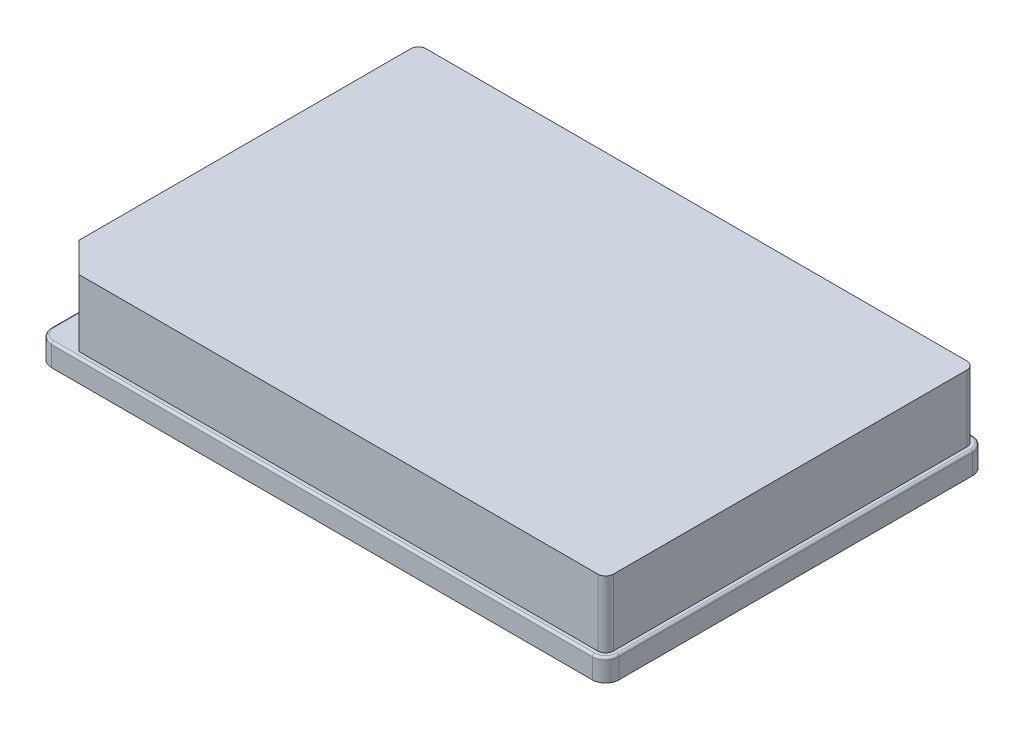
ISO-10303-21;
HEADER;
FILE_DESCRIPTION(('STEP AP214'),'2;1');
FILE_NAME('part.step','',(''),(''),'','','');
FILE_SCHEMA(('AUTOMOTIVE_DESIGN { 1 0 10303 214 1 1 1 1 }'));
ENDSEC;
DATA;
#1=APPLICATION_CONTEXT('core data for automotive mechanical design processes');
#2=APPLICATION_PROTOCOL_DEFINITION('international standard','automotive_design',2000,#1);
#3=PRODUCT_CONTEXT('',#1,'mechanical');
#4=PRODUCT('Part','Part','',(#3));
#5=PRODUCT_RELATED_PRODUCT_CATEGORY('part','',(#4));
#6=PRODUCT_DEFINITION_FORMATION('','',#4);
#7=PRODUCT_DEFINITION_CONTEXT('part definition',#1,'design');
#8=PRODUCT_DEFINITION('design','',#6,#7);
#9=PRODUCT_DEFINITION_SHAPE('','',#8);
#10=(LENGTH_UNIT() NAMED_UNIT(*) SI_UNIT(.MILLI.,.METRE.));
#11=(NAMED_UNIT(*) PLANE_ANGLE_UNIT() SI_UNIT($,.RADIAN.));
#12=(NAMED_UNIT(*) SI_UNIT($,.STERADIAN.) SOLID_ANGLE_UNIT());
#13=UNCERTAINTY_MEASURE_WITH_UNIT(LENGTH_MEASURE(1.E-05),#10,'distance_accuracy_value','');
#14=(GEOMETRIC_REPRESENTATION_CONTEXT(3) GLOBAL_UNCERTAINTY_ASSIGNED_CONTEXT((#13)) GLOBAL_UNIT_ASSIGNED_CONTEXT((#10,
#11,#12)) REPRESENTATION_CONTEXT('',''));
#15=CARTESIAN_POINT('',(0.,0.,0.));
#16=DIRECTION('',(0.,0.,1.));
#17=DIRECTION('',(1.,0.,0.));
#18=AXIS2_PLACEMENT_3D('',#15,#16,#17);
#19=CARTESIAN_POINT('',(-63.875,20.,42.8));
#20=DIRECTION('',(1.,0.,0.));
#21=DIRECTION('',(0.,0.,-1.));
#22=AXIS2_PLACEMENT_3D('',#19,#20,#21);
#23=PLANE('',#22);
#24=DIRECTION('',(0.,-1.,0.));
#25=VECTOR('',#24,1.);
#26=CARTESIAN_POINT('',(-63.875,20.,39.8));
#27=LINE('',#26,#25);
#28=CARTESIAN_POINT('',(-63.875,0.,39.8));
#29=VERTEX_POINT('',#28);
#30=CARTESIAN_POINT('',(-63.875,4.5,39.8));
#31=VERTEX_POINT('',#30);
#32=EDGE_CURVE('E250',#29,#31,#27,.F.);
#33=ORIENTED_EDGE('',*,*,#32,.T.);
#34=DIRECTION('',(0.,0.,1.));
#35=VECTOR('',#34,1.);
#36=CARTESIAN_POINT('',(-63.875,4.5,42.8));
#37=LINE('',#36,#35);
#38=CARTESIAN_POINT('',(-63.875,4.5,-39.8));
#39=VERTEX_POINT('',#38);
#40=EDGE_CURVE('E296',#31,#39,#37,.F.);
#41=ORIENTED_EDGE('',*,*,#40,.T.);
#42=DIRECTION('',(0.,-1.,0.));
#43=VECTOR('',#42,1.);
#44=CARTESIAN_POINT('',(-63.875,20.,-39.8));
#45=LINE('',#44,#43);
#46=CARTESIAN_POINT('',(-63.875,0.,-39.8));
#47=VERTEX_POINT('',#46);
#48=EDGE_CURVE('E253',#39,#47,#45,.T.);
#49=ORIENTED_EDGE('',*,*,#48,.T.);
#50=DIRECTION('',(0.,0.,1.));
#51=VECTOR('',#50,1.);
#52=CARTESIAN_POINT('',(-63.875,0.,42.8));
#53=LINE('',#52,#51);
#54=EDGE_CURVE('E210',#47,#29,#53,.T.);
#55=ORIENTED_EDGE('',*,*,#54,.T.);
#56=EDGE_LOOP('',(#33,#41,#49,#55));
#57=FACE_BOUND('',#56,.T.);
#58=ADVANCED_FACE('F37',(#57),#23,.F.);
#59=CARTESIAN_POINT('',(-63.875,20.,42.8));
#60=DIRECTION('',(0.,0.,-1.));
#61=DIRECTION('',(-1.,0.,0.));
#62=AXIS2_PLACEMENT_3D('',#59,#60,#61);
#63=PLANE('',#62);
#64=DIRECTION('',(0.,-1.,0.));
#65=VECTOR('',#64,1.);
#66=CARTESIAN_POINT('',(60.875,20.,42.8));
#67=LINE('',#66,#65);
#68=CARTESIAN_POINT('',(60.875,0.,42.8));
#69=VERTEX_POINT('',#68);
#70=CARTESIAN_POINT('',(60.875,4.5,42.8));
#71=VERTEX_POINT('',#70);
#72=EDGE_CURVE('E268',#69,#71,#67,.F.);
#73=ORIENTED_EDGE('',*,*,#72,.T.);
#74=DIRECTION('',(1.,0.,0.));
#75=VECTOR('',#74,1.);
#76=CARTESIAN_POINT('',(-63.875,4.5,42.8));
#77=LINE('',#76,#75);
#78=CARTESIAN_POINT('',(-60.875,4.5,42.8));
#79=VERTEX_POINT('',#78);
#80=EDGE_CURVE('E12',#71,#79,#77,.F.);
#81=ORIENTED_EDGE('',*,*,#80,.T.);
#82=DIRECTION('',(0.,-1.,0.));
#83=VECTOR('',#82,1.);
#84=CARTESIAN_POINT('',(-60.875,20.,42.8));
#85=LINE('',#84,#83);
#86=CARTESIAN_POINT('',(-60.875,0.,42.8));
#87=VERTEX_POINT('',#86);
#88=EDGE_CURVE('E270',#79,#87,#85,.T.);
#89=ORIENTED_EDGE('',*,*,#88,.T.);
#90=DIRECTION('',(1.,0.,0.));
#91=VECTOR('',#90,1.);
#92=CARTESIAN_POINT('',(-63.875,0.,42.8));
#93=LINE('',#92,#91);
#94=EDGE_CURVE('E241',#87,#69,#93,.T.);
#95=ORIENTED_EDGE('',*,*,#94,.T.);
#96=EDGE_LOOP('',(#73,#81,#89,#95));
#97=FACE_BOUND('',#96,.T.);
#98=ADVANCED_FACE('F381',(#97),#63,.F.);
#99=CARTESIAN_POINT('',(63.875,20.,42.8));
#100=DIRECTION('',(-1.,0.,0.));
#101=DIRECTION('',(0.,0.,1.));
#102=AXIS2_PLACEMENT_3D('',#99,#100,#101);
#103=PLANE('',#102);
#104=DIRECTION('',(0.,-1.,0.));
#105=VECTOR('',#104,1.);
#106=CARTESIAN_POINT('',(63.875,20.,-39.8));
#107=LINE('',#106,#105);
#108=CARTESIAN_POINT('',(63.875,0.,-39.8));
#109=VERTEX_POINT('',#108);
#110=CARTESIAN_POINT('',(63.875,4.5,-39.8));
#111=VERTEX_POINT('',#110);
#112=EDGE_CURVE('E272',#109,#111,#107,.F.);
#113=ORIENTED_EDGE('',*,*,#112,.T.);
#114=DIRECTION('',(0.,0.,-1.));
#115=VECTOR('',#114,1.);
#116=CARTESIAN_POINT('',(63.875,4.5,42.8));
#117=LINE('',#116,#115);
#118=CARTESIAN_POINT('',(63.875,4.5,39.8));
#119=VERTEX_POINT('',#118);
#120=EDGE_CURVE('E61',#111,#119,#117,.F.);
#121=ORIENTED_EDGE('',*,*,#120,.T.);
#122=DIRECTION('',(0.,-1.,0.));
#123=VECTOR('',#122,1.);
#124=CARTESIAN_POINT('',(63.875,20.,39.8));
#125=LINE('',#124,#123);
#126=CARTESIAN_POINT('',(63.875,0.,39.8));
#127=VERTEX_POINT('',#126);
#128=EDGE_CURVE('E274',#119,#127,#125,.T.);
#129=ORIENTED_EDGE('',*,*,#128,.T.);
#130=DIRECTION('',(0.,0.,-1.));
#131=VECTOR('',#130,1.);
#132=CARTESIAN_POINT('',(63.875,0.,42.8));
#133=LINE('',#132,#131);
#134=EDGE_CURVE('E244',#127,#109,#133,.T.);
#135=ORIENTED_EDGE('',*,*,#134,.T.);
#136=EDGE_LOOP('',(#113,#121,#129,#135));
#137=FACE_BOUND('',#136,.T.);
#138=ADVANCED_FACE('F341',(#137),#103,.F.);
#139=CARTESIAN_POINT('',(-63.875,20.,-42.8));
#140=DIRECTION('',(0.,0.,1.));
#141=DIRECTION('',(1.,0.,0.));
#142=AXIS2_PLACEMENT_3D('',#139,#140,#141);
#143=PLANE('',#142);
#144=DIRECTION('',(0.,-1.,0.));
#145=VECTOR('',#144,1.);
#146=CARTESIAN_POINT('',(-60.875,20.,-42.8));
#147=LINE('',#146,#145);
#148=CARTESIAN_POINT('',(-60.875,0.,-42.8));
#149=VERTEX_POINT('',#148);
#150=CARTESIAN_POINT('',(-60.875,4.5,-42.8));
#151=VERTEX_POINT('',#150);
#152=EDGE_CURVE('E265',#149,#151,#147,.F.);
#153=ORIENTED_EDGE('',*,*,#152,.T.);
#154=DIRECTION('',(-1.,0.,0.));
#155=VECTOR('',#154,1.);
#156=CARTESIAN_POINT('',(-63.875,4.5,-42.8));
#157=LINE('',#156,#155);
#158=CARTESIAN_POINT('',(60.875,4.5,-42.8));
#159=VERTEX_POINT('',#158);
#160=EDGE_CURVE('E300',#151,#159,#157,.F.);
#161=ORIENTED_EDGE('',*,*,#160,.T.);
#162=DIRECTION('',(0.,-1.,0.));
#163=VECTOR('',#162,1.);
#164=CARTESIAN_POINT('',(60.875,20.,-42.8));
#165=LINE('',#164,#163);
#166=CARTESIAN_POINT('',(60.875,0.,-42.8));
#167=VERTEX_POINT('',#166);
#168=EDGE_CURVE('E263',#159,#167,#165,.T.);
#169=ORIENTED_EDGE('',*,*,#168,.T.);
#170=DIRECTION('',(-1.,0.,0.));
#171=VECTOR('',#170,1.);
#172=CARTESIAN_POINT('',(-63.875,0.,-42.8));
#173=LINE('',#172,#171);
#174=EDGE_CURVE('E247',#167,#149,#173,.T.);
#175=ORIENTED_EDGE('',*,*,#174,.T.);
#176=EDGE_LOOP('',(#153,#161,#169,#175));
#177=FACE_BOUND('',#176,.T.);
#178=ADVANCED_FACE('F352',(#177),#143,.F.);
#179=CARTESIAN_POINT('',(0.,0.,0.));
#180=DIRECTION('',(0.,-1.,0.));
#181=DIRECTION('',(0.,0.,-1.));
#182=AXIS2_PLACEMENT_3D('',#179,#180,#181);
#183=PLANE('',#182);
#184=ORIENTED_EDGE('',*,*,#54,.F.);
#185=CARTESIAN_POINT('',(-60.875,0.,-39.8));
#186=DIRECTION('',(0.,-1.,0.));
#187=DIRECTION('',(0.,0.,-1.));
#188=AXIS2_PLACEMENT_3D('',#185,#186,#187);
#189=CIRCLE('',#188,3.);
#190=EDGE_CURVE('E261',#47,#149,#189,.T.);
#191=ORIENTED_EDGE('',*,*,#190,.T.);
#192=ORIENTED_EDGE('',*,*,#174,.F.);
#193=CARTESIAN_POINT('',(60.875,0.,-39.8));
#194=DIRECTION('',(0.,-1.,0.));
#195=DIRECTION('',(0.,0.,-1.));
#196=AXIS2_PLACEMENT_3D('',#193,#194,#195);
#197=CIRCLE('',#196,3.);
#198=EDGE_CURVE('E255',#167,#109,#197,.T.);
#199=ORIENTED_EDGE('',*,*,#198,.T.);
#200=ORIENTED_EDGE('',*,*,#134,.F.);
#201=CARTESIAN_POINT('',(60.875,0.,39.8));
#202=DIRECTION('',(0.,-1.,0.));
#203=DIRECTION('',(0.,0.,-1.));
#204=AXIS2_PLACEMENT_3D('',#201,#202,#203);
#205=CIRCLE('',#204,3.);
#206=EDGE_CURVE('E257',#127,#69,#205,.T.);
#207=ORIENTED_EDGE('',*,*,#206,.T.);
#208=ORIENTED_EDGE('',*,*,#94,.F.);
#209=CARTESIAN_POINT('',(-60.875,0.,39.8));
#210=DIRECTION('',(0.,-1.,0.));
#211=DIRECTION('',(0.,0.,-1.));
#212=AXIS2_PLACEMENT_3D('',#209,#210,#211);
#213=CIRCLE('',#212,3.);
#214=EDGE_CURVE('E259',#87,#29,#213,.T.);
#215=ORIENTED_EDGE('',*,*,#214,.T.);
#216=EDGE_LOOP('',(#184,#191,#192,#199,#200,#207,#208,#215));
#217=FACE_BOUND('',#216,.T.);
#218=ADVANCED_FACE('F346',(#217),#183,.T.);
#219=CARTESIAN_POINT('',(-60.875,20.,-39.8));
#220=DIRECTION('',(0.,-1.,0.));
#221=DIRECTION('',(0.,0.,-1.));
#222=AXIS2_PLACEMENT_3D('',#219,#220,#221);
#223=CYLINDRICAL_SURFACE('',#222,3.);
#224=ORIENTED_EDGE('',*,*,#48,.F.);
#225=CARTESIAN_POINT('',(-60.875,4.5,-39.8));
#226=DIRECTION('',(0.,-1.,0.));
#227=DIRECTION('',(0.,0.,-1.));
#228=AXIS2_PLACEMENT_3D('',#225,#226,#227);
#229=CIRCLE('',#228,3.);
#230=EDGE_CURVE('E298',#39,#151,#229,.T.);
#231=ORIENTED_EDGE('',*,*,#230,.T.);
#232=ORIENTED_EDGE('',*,*,#152,.F.);
#233=ORIENTED_EDGE('',*,*,#190,.F.);
#234=EDGE_LOOP('',(#224,#231,#232,#233));
#235=FACE_BOUND('',#234,.T.);
#236=ADVANCED_FACE('F355',(#235),#223,.T.);
#237=CARTESIAN_POINT('',(-60.875,20.,39.8));
#238=DIRECTION('',(0.,-1.,0.));
#239=DIRECTION('',(0.,0.,-1.));
#240=AXIS2_PLACEMENT_3D('',#237,#238,#239);
#241=CYLINDRICAL_SURFACE('',#240,3.);
#242=ORIENTED_EDGE('',*,*,#88,.F.);
#243=CARTESIAN_POINT('',(-60.875,4.5,39.8));
#244=DIRECTION('',(0.,-1.,0.));
#245=DIRECTION('',(0.,0.,-1.));
#246=AXIS2_PLACEMENT_3D('',#243,#244,#245);
#247=CIRCLE('',#246,3.);
#248=EDGE_CURVE('E293',#79,#31,#247,.T.);
#249=ORIENTED_EDGE('',*,*,#248,.T.);
#250=ORIENTED_EDGE('',*,*,#32,.F.);
#251=ORIENTED_EDGE('',*,*,#214,.F.);
#252=EDGE_LOOP('',(#242,#249,#250,#251));
#253=FACE_BOUND('',#252,.T.);
#254=ADVANCED_FACE('F385',(#253),#241,.T.);
#255=CARTESIAN_POINT('',(60.875,20.,39.8));
#256=DIRECTION('',(0.,-1.,0.));
#257=DIRECTION('',(0.,0.,-1.));
#258=AXIS2_PLACEMENT_3D('',#255,#256,#257);
#259=CYLINDRICAL_SURFACE('',#258,3.);
#260=ORIENTED_EDGE('',*,*,#128,.F.);
#261=CARTESIAN_POINT('',(60.875,4.5,39.8));
#262=DIRECTION('',(0.,-1.,0.));
#263=DIRECTION('',(0.,0.,-1.));
#264=AXIS2_PLACEMENT_3D('',#261,#262,#263);
#265=CIRCLE('',#264,3.);
#266=EDGE_CURVE('E46',#119,#71,#265,.T.);
#267=ORIENTED_EDGE('',*,*,#266,.T.);
#268=ORIENTED_EDGE('',*,*,#72,.F.);
#269=ORIENTED_EDGE('',*,*,#206,.F.);
#270=EDGE_LOOP('',(#260,#267,#268,#269));
#271=FACE_BOUND('',#270,.T.);
#272=ADVANCED_FACE('F409',(#271),#259,.T.);
#273=CARTESIAN_POINT('',(60.875,20.,-39.8));
#274=DIRECTION('',(0.,-1.,0.));
#275=DIRECTION('',(0.,0.,-1.));
#276=AXIS2_PLACEMENT_3D('',#273,#274,#275);
#277=CYLINDRICAL_SURFACE('',#276,3.);
#278=ORIENTED_EDGE('',*,*,#168,.F.);
#279=CARTESIAN_POINT('',(60.875,4.5,-39.8));
#280=DIRECTION('',(0.,-1.,0.));
#281=DIRECTION('',(0.,0.,-1.));
#282=AXIS2_PLACEMENT_3D('',#279,#280,#281);
#283=CIRCLE('',#282,3.);
#284=EDGE_CURVE('E302',#159,#111,#283,.T.);
#285=ORIENTED_EDGE('',*,*,#284,.T.);
#286=ORIENTED_EDGE('',*,*,#112,.F.);
#287=ORIENTED_EDGE('',*,*,#198,.F.);
#288=EDGE_LOOP('',(#278,#285,#286,#287));
#289=FACE_BOUND('',#288,.T.);
#290=ADVANCED_FACE('F339',(#289),#277,.T.);
#291=CARTESIAN_POINT('',(-60.875,-153.777184588612,-39.8));
#292=DIRECTION('',(0.,1.,0.));
#293=DIRECTION('',(0.,0.,1.));
#294=AXIS2_PLACEMENT_3D('',#291,#292,#293);
#295=CYLINDRICAL_SURFACE('',#294,1.75000000000002);
#296=CARTESIAN_POINT('',(-60.875,5.,-39.8));
#297=DIRECTION('',(0.,-1.,0.));
#298=DIRECTION('',(0.,0.,-1.));
#299=AXIS2_PLACEMENT_3D('',#296,#297,#298);
#300=CIRCLE('',#299,1.75000000000002);
#301=CARTESIAN_POINT('',(-60.875,5.,-41.55));
#302=VERTEX_POINT('',#301);
#303=CARTESIAN_POINT('',(-62.625,5.,-39.8));
#304=VERTEX_POINT('',#303);
#305=EDGE_CURVE('E192',#302,#304,#300,.F.);
#306=ORIENTED_EDGE('',*,*,#305,.T.);
#307=DIRECTION('',(0.,1.,0.));
#308=VECTOR('',#307,1.);
#309=CARTESIAN_POINT('',(-62.625,-153.777184588612,-39.8));
#310=LINE('',#309,#308);
#311=CARTESIAN_POINT('',(-62.625,20.,-39.8));
#312=VERTEX_POINT('',#311);
#313=EDGE_CURVE('E176',#304,#312,#310,.T.);
#314=ORIENTED_EDGE('',*,*,#313,.T.);
#315=CARTESIAN_POINT('',(-60.875,20.,-39.8));
#316=DIRECTION('',(0.,1.,0.));
#317=DIRECTION('',(0.,0.,1.));
#318=AXIS2_PLACEMENT_3D('',#315,#316,#317);
#319=CIRCLE('',#318,1.75000000000002);
#320=CARTESIAN_POINT('',(-60.875,20.,-41.55));
#321=VERTEX_POINT('',#320);
#322=EDGE_CURVE('E204',#321,#312,#319,.T.);
#323=ORIENTED_EDGE('',*,*,#322,.F.);
#324=DIRECTION('',(0.,1.,0.));
#325=VECTOR('',#324,1.);
#326=CARTESIAN_POINT('',(-60.875,-153.777184588612,-41.55));
#327=LINE('',#326,#325);
#328=EDGE_CURVE('E198',#302,#321,#327,.T.);
#329=ORIENTED_EDGE('',*,*,#328,.F.);
#330=EDGE_LOOP('',(#306,#314,#323,#329));
#331=FACE_BOUND('',#330,.T.);
#332=ADVANCED_FACE('F197',(#331),#295,.T.);
#333=CARTESIAN_POINT('',(60.875,-153.777184588612,-41.55));
#334=DIRECTION('',(0.,0.,-1.));
#335=DIRECTION('',(-1.,0.,0.));
#336=AXIS2_PLACEMENT_3D('',#333,#334,#335);
#337=PLANE('',#336);
#338=DIRECTION('',(-1.,0.,0.));
#339=VECTOR('',#338,1.);
#340=CARTESIAN_POINT('',(60.875,5.,-41.55));
#341=LINE('',#340,#339);
#342=CARTESIAN_POINT('',(60.875,5.,-41.55));
#343=VERTEX_POINT('',#342);
#344=EDGE_CURVE('E200',#343,#302,#341,.T.);
#345=ORIENTED_EDGE('',*,*,#344,.T.);
#346=ORIENTED_EDGE('',*,*,#328,.T.);
#347=DIRECTION('',(-1.,0.,0.));
#348=VECTOR('',#347,1.);
#349=CARTESIAN_POINT('',(60.875,20.,-41.55));
#350=LINE('',#349,#348);
#351=CARTESIAN_POINT('',(60.875,20.,-41.55));
#352=VERTEX_POINT('',#351);
#353=EDGE_CURVE('E224',#352,#321,#350,.T.);
#354=ORIENTED_EDGE('',*,*,#353,.F.);
#355=DIRECTION('',(0.,1.,0.));
#356=VECTOR('',#355,1.);
#357=CARTESIAN_POINT('',(60.875,-153.777184588612,-41.55));
#358=LINE('',#357,#356);
#359=EDGE_CURVE('E222',#343,#352,#358,.T.);
#360=ORIENTED_EDGE('',*,*,#359,.F.);
#361=EDGE_LOOP('',(#345,#346,#354,#360));
#362=FACE_BOUND('',#361,.T.);
#363=ADVANCED_FACE('F415',(#362),#337,.T.);
#364=CARTESIAN_POINT('',(60.875,-153.777184588612,-39.8));
#365=DIRECTION('',(0.,1.,0.));
#366=DIRECTION('',(0.,0.,1.));
#367=AXIS2_PLACEMENT_3D('',#364,#365,#366);
#368=CYLINDRICAL_SURFACE('',#367,1.75);
#369=CARTESIAN_POINT('',(60.875,5.,-39.8));
#370=DIRECTION('',(0.,-1.,0.));
#371=DIRECTION('',(0.,0.,-1.));
#372=AXIS2_PLACEMENT_3D('',#369,#370,#371);
#373=CIRCLE('',#372,1.75);
#374=CARTESIAN_POINT('',(62.625,5.,-39.8));
#375=VERTEX_POINT('',#374);
#376=EDGE_CURVE('E207',#375,#343,#373,.F.);
#377=ORIENTED_EDGE('',*,*,#376,.T.);
#378=ORIENTED_EDGE('',*,*,#359,.T.);
#379=CARTESIAN_POINT('',(60.875,20.,-39.8));
#380=DIRECTION('',(0.,1.,0.));
#381=DIRECTION('',(0.,0.,1.));
#382=AXIS2_PLACEMENT_3D('',#379,#380,#381);
#383=CIRCLE('',#382,1.75);
#384=CARTESIAN_POINT('',(62.625,20.,-39.8));
#385=VERTEX_POINT('',#384);
#386=EDGE_CURVE('E227',#385,#352,#383,.T.);
#387=ORIENTED_EDGE('',*,*,#386,.F.);
#388=DIRECTION('',(0.,1.,0.));
#389=VECTOR('',#388,1.);
#390=CARTESIAN_POINT('',(62.625,-153.777184588612,-39.8));
#391=LINE('',#390,#389);
#392=EDGE_CURVE('E225',#375,#385,#391,.T.);
#393=ORIENTED_EDGE('',*,*,#392,.F.);
#394=EDGE_LOOP('',(#377,#378,#387,#393));
#395=FACE_BOUND('',#394,.T.);
#396=ADVANCED_FACE('F420',(#395),#368,.T.);
#397=CARTESIAN_POINT('',(62.625,-153.777184588612,39.8));
#398=DIRECTION('',(1.,0.,0.));
#399=DIRECTION('',(0.,0.,-1.));
#400=AXIS2_PLACEMENT_3D('',#397,#398,#399);
#401=PLANE('',#400);
#402=DIRECTION('',(0.,0.,-1.));
#403=VECTOR('',#402,1.);
#404=CARTESIAN_POINT('',(62.625,5.,39.8));
#405=LINE('',#404,#403);
#406=CARTESIAN_POINT('',(62.625,5.,39.8));
#407=VERTEX_POINT('',#406);
#408=EDGE_CURVE('E211',#407,#375,#405,.T.);
#409=ORIENTED_EDGE('',*,*,#408,.T.);
#410=ORIENTED_EDGE('',*,*,#392,.T.);
#411=DIRECTION('',(0.,0.,-1.));
#412=VECTOR('',#411,1.);
#413=CARTESIAN_POINT('',(62.625,20.,39.8));
#414=LINE('',#413,#412);
#415=CARTESIAN_POINT('',(62.625,20.,39.8));
#416=VERTEX_POINT('',#415);
#417=EDGE_CURVE('E230',#416,#385,#414,.T.);
#418=ORIENTED_EDGE('',*,*,#417,.F.);
#419=DIRECTION('',(0.,1.,0.));
#420=VECTOR('',#419,1.);
#421=CARTESIAN_POINT('',(62.625,-153.777184588612,39.8));
#422=LINE('',#421,#420);
#423=EDGE_CURVE('E228',#407,#416,#422,.T.);
#424=ORIENTED_EDGE('',*,*,#423,.F.);
#425=EDGE_LOOP('',(#409,#410,#418,#424));
#426=FACE_BOUND('',#425,.T.);
#427=ADVANCED_FACE('F600',(#426),#401,.T.);
#428=CARTESIAN_POINT('',(60.875,-153.777184588612,39.8));
#429=DIRECTION('',(0.,1.,0.));
#430=DIRECTION('',(0.,0.,1.));
#431=AXIS2_PLACEMENT_3D('',#428,#429,#430);
#432=CYLINDRICAL_SURFACE('',#431,1.75);
#433=CARTESIAN_POINT('',(60.875,5.,39.8));
#434=DIRECTION('',(0.,-1.,0.));
#435=DIRECTION('',(0.,0.,-1.));
#436=AXIS2_PLACEMENT_3D('',#433,#434,#435);
#437=CIRCLE('',#436,1.75);
#438=CARTESIAN_POINT('',(60.875,5.,41.55));
#439=VERTEX_POINT('',#438);
#440=EDGE_CURVE('E214',#439,#407,#437,.F.);
#441=ORIENTED_EDGE('',*,*,#440,.T.);
#442=ORIENTED_EDGE('',*,*,#423,.T.);
#443=CARTESIAN_POINT('',(60.875,20.,39.8));
#444=DIRECTION('',(0.,1.,0.));
#445=DIRECTION('',(0.,0.,1.));
#446=AXIS2_PLACEMENT_3D('',#443,#444,#445);
#447=CIRCLE('',#446,1.75);
#448=CARTESIAN_POINT('',(60.875,20.,41.55));
#449=VERTEX_POINT('',#448);
#450=EDGE_CURVE('E233',#449,#416,#447,.T.);
#451=ORIENTED_EDGE('',*,*,#450,.F.);
#452=DIRECTION('',(0.,1.,0.));
#453=VECTOR('',#452,1.);
#454=CARTESIAN_POINT('',(60.875,-153.777184588612,41.55));
#455=LINE('',#454,#453);
#456=EDGE_CURVE('E231',#439,#449,#455,.T.);
#457=ORIENTED_EDGE('',*,*,#456,.F.);
#458=EDGE_LOOP('',(#441,#442,#451,#457));
#459=FACE_BOUND('',#458,.T.);
#460=ADVANCED_FACE('F590',(#459),#432,.T.);
#461=CARTESIAN_POINT('',(-55.8750000000001,-153.777184588612,41.55));
#462=DIRECTION('',(0.,0.,1.));
#463=DIRECTION('',(1.,0.,0.));
#464=AXIS2_PLACEMENT_3D('',#461,#462,#463);
#465=PLANE('',#464);
#466=DIRECTION('',(1.,0.,0.));
#467=VECTOR('',#466,1.);
#468=CARTESIAN_POINT('',(-55.8750000000001,5.,41.55));
#469=LINE('',#468,#467);
#470=CARTESIAN_POINT('',(-55.8750000000001,5.,41.55));
#471=VERTEX_POINT('',#470);
#472=EDGE_CURVE('E217',#471,#439,#469,.T.);
#473=ORIENTED_EDGE('',*,*,#472,.T.);
#474=ORIENTED_EDGE('',*,*,#456,.T.);
#475=DIRECTION('',(1.,0.,0.));
#476=VECTOR('',#475,1.);
#477=CARTESIAN_POINT('',(-55.8750000000001,20.,41.55));
#478=LINE('',#477,#476);
#479=CARTESIAN_POINT('',(-55.8750000000001,20.,41.55));
#480=VERTEX_POINT('',#479);
#481=EDGE_CURVE('E236',#480,#449,#478,.T.);
#482=ORIENTED_EDGE('',*,*,#481,.F.);
#483=DIRECTION('',(0.,1.,0.));
#484=VECTOR('',#483,1.);
#485=CARTESIAN_POINT('',(-55.8750000000001,-153.777184588612,41.55));
#486=LINE('',#485,#484);
#487=EDGE_CURVE('E234',#471,#480,#486,.T.);
#488=ORIENTED_EDGE('',*,*,#487,.F.);
#489=EDGE_LOOP('',(#473,#474,#482,#488));
#490=FACE_BOUND('',#489,.T.);
#491=ADVANCED_FACE('F580',(#490),#465,.T.);
#492=CARTESIAN_POINT('',(-62.625,-153.777184588612,34.8));
#493=DIRECTION('',(-0.707106781186554,0.,0.707106781186541));
#494=DIRECTION('',(0.707106781186541,0.,0.707106781186554));
#495=AXIS2_PLACEMENT_3D('',#492,#493,#494);
#496=PLANE('',#495);
#497=DIRECTION('',(0.707106781186541,0.,0.707106781186554));
#498=VECTOR('',#497,1.);
#499=CARTESIAN_POINT('',(-62.625,5.,34.8));
#500=LINE('',#499,#498);
#501=CARTESIAN_POINT('',(-62.625,5.,34.8));
#502=VERTEX_POINT('',#501);
#503=EDGE_CURVE('E195',#502,#471,#500,.T.);
#504=ORIENTED_EDGE('',*,*,#503,.T.);
#505=ORIENTED_EDGE('',*,*,#487,.T.);
#506=DIRECTION('',(0.707106781186541,0.,0.707106781186554));
#507=VECTOR('',#506,1.);
#508=CARTESIAN_POINT('',(-62.625,20.,34.8));
#509=LINE('',#508,#507);
#510=CARTESIAN_POINT('',(-62.625,20.,34.8));
#511=VERTEX_POINT('',#510);
#512=EDGE_CURVE('E187',#511,#480,#509,.T.);
#513=ORIENTED_EDGE('',*,*,#512,.F.);
#514=DIRECTION('',(0.,1.,0.));
#515=VECTOR('',#514,1.);
#516=CARTESIAN_POINT('',(-62.625,-153.777184588612,34.8));
#517=LINE('',#516,#515);
#518=EDGE_CURVE('E237',#502,#511,#517,.T.);
#519=ORIENTED_EDGE('',*,*,#518,.F.);
#520=EDGE_LOOP('',(#504,#505,#513,#519));
#521=FACE_BOUND('',#520,.T.);
#522=ADVANCED_FACE('F571',(#521),#496,.T.);
#523=CARTESIAN_POINT('',(-62.625,-153.777184588612,-39.8));
#524=DIRECTION('',(-1.,0.,0.));
#525=DIRECTION('',(0.,0.,1.));
#526=AXIS2_PLACEMENT_3D('',#523,#524,#525);
#527=PLANE('',#526);
#528=DIRECTION('',(0.,0.,1.));
#529=VECTOR('',#528,1.);
#530=CARTESIAN_POINT('',(-62.625,5.,-39.8));
#531=LINE('',#530,#529);
#532=EDGE_CURVE('E180',#304,#502,#531,.T.);
#533=ORIENTED_EDGE('',*,*,#532,.T.);
#534=ORIENTED_EDGE('',*,*,#518,.T.);
#535=DIRECTION('',(0.,0.,1.));
#536=VECTOR('',#535,1.);
#537=CARTESIAN_POINT('',(-62.625,20.,-39.8));
#538=LINE('',#537,#536);
#539=EDGE_CURVE('E182',#312,#511,#538,.T.);
#540=ORIENTED_EDGE('',*,*,#539,.F.);
#541=ORIENTED_EDGE('',*,*,#313,.F.);
#542=EDGE_LOOP('',(#533,#534,#540,#541));
#543=FACE_BOUND('',#542,.T.);
#544=ADVANCED_FACE('F178',(#543),#527,.T.);
#545=CARTESIAN_POINT('',(0.,5.,0.));
#546=DIRECTION('',(0.,-1.,0.));
#547=DIRECTION('',(0.,0.,-1.));
#548=AXIS2_PLACEMENT_3D('',#545,#546,#547);
#549=PLANE('',#548);
#550=DIRECTION('',(0.,0.,1.));
#551=VECTOR('',#550,1.);
#552=CARTESIAN_POINT('',(-63.375,5.,0.));
#553=LINE('',#552,#551);
#554=CARTESIAN_POINT('',(-63.375,5.,-39.8));
#555=VERTEX_POINT('',#554);
#556=CARTESIAN_POINT('',(-63.375,5.,39.8));
#557=VERTEX_POINT('',#556);
#558=EDGE_CURVE('E288',#555,#557,#553,.T.);
#559=ORIENTED_EDGE('',*,*,#558,.T.);
#560=CARTESIAN_POINT('',(-60.875,5.,39.8));
#561=DIRECTION('',(0.,-1.,0.));
#562=DIRECTION('',(0.,0.,-1.));
#563=AXIS2_PLACEMENT_3D('',#560,#561,#562);
#564=CIRCLE('',#563,2.5);
#565=CARTESIAN_POINT('',(-60.875,5.,42.3));
#566=VERTEX_POINT('',#565);
#567=EDGE_CURVE('E290',#557,#566,#564,.F.);
#568=ORIENTED_EDGE('',*,*,#567,.T.);
#569=DIRECTION('',(1.,0.,0.));
#570=VECTOR('',#569,1.);
#571=CARTESIAN_POINT('',(0.,5.,42.3));
#572=LINE('',#571,#570);
#573=CARTESIAN_POINT('',(60.875,5.,42.3));
#574=VERTEX_POINT('',#573);
#575=EDGE_CURVE('E276',#566,#574,#572,.T.);
#576=ORIENTED_EDGE('',*,*,#575,.T.);
#577=CARTESIAN_POINT('',(60.875,5.,39.8));
#578=DIRECTION('',(0.,-1.,0.));
#579=DIRECTION('',(0.,0.,-1.));
#580=AXIS2_PLACEMENT_3D('',#577,#578,#579);
#581=CIRCLE('',#580,2.5);
#582=CARTESIAN_POINT('',(63.375,5.,39.8));
#583=VERTEX_POINT('',#582);
#584=EDGE_CURVE('E278',#574,#583,#581,.F.);
#585=ORIENTED_EDGE('',*,*,#584,.T.);
#586=DIRECTION('',(0.,0.,-1.));
#587=VECTOR('',#586,1.);
#588=CARTESIAN_POINT('',(63.375,5.,0.));
#589=LINE('',#588,#587);
#590=CARTESIAN_POINT('',(63.375,5.,-39.8));
#591=VERTEX_POINT('',#590);
#592=EDGE_CURVE('E280',#583,#591,#589,.T.);
#593=ORIENTED_EDGE('',*,*,#592,.T.);
#594=CARTESIAN_POINT('',(60.875,5.,-39.8));
#595=DIRECTION('',(0.,-1.,0.));
#596=DIRECTION('',(0.,0.,-1.));
#597=AXIS2_PLACEMENT_3D('',#594,#595,#596);
#598=CIRCLE('',#597,2.5);
#599=CARTESIAN_POINT('',(60.875,5.,-42.3));
#600=VERTEX_POINT('',#599);
#601=EDGE_CURVE('E282',#591,#600,#598,.F.);
#602=ORIENTED_EDGE('',*,*,#601,.T.);
#603=DIRECTION('',(-1.,0.,0.));
#604=VECTOR('',#603,1.);
#605=CARTESIAN_POINT('',(0.,5.,-42.3));
#606=LINE('',#605,#604);
#607=CARTESIAN_POINT('',(-60.875,5.,-42.3));
#608=VERTEX_POINT('',#607);
#609=EDGE_CURVE('E284',#600,#608,#606,.T.);
#610=ORIENTED_EDGE('',*,*,#609,.T.);
#611=CARTESIAN_POINT('',(-60.875,5.,-39.8));
#612=DIRECTION('',(0.,-1.,0.));
#613=DIRECTION('',(0.,0.,-1.));
#614=AXIS2_PLACEMENT_3D('',#611,#612,#613);
#615=CIRCLE('',#614,2.5);
#616=EDGE_CURVE('E286',#608,#555,#615,.F.);
#617=ORIENTED_EDGE('',*,*,#616,.T.);
#618=EDGE_LOOP('',(#559,#568,#576,#585,#593,#602,#610,#617));
#619=FACE_BOUND('',#618,.T.);
#620=ORIENTED_EDGE('',*,*,#344,.F.);
#621=ORIENTED_EDGE('',*,*,#376,.F.);
#622=ORIENTED_EDGE('',*,*,#408,.F.);
#623=ORIENTED_EDGE('',*,*,#440,.F.);
#624=ORIENTED_EDGE('',*,*,#472,.F.);
#625=ORIENTED_EDGE('',*,*,#503,.F.);
#626=ORIENTED_EDGE('',*,*,#532,.F.);
#627=ORIENTED_EDGE('',*,*,#305,.F.);
#628=EDGE_LOOP('',(#620,#621,#622,#623,#624,#625,#626,#627));
#629=FACE_BOUND('',#628,.T.);
#630=ADVANCED_FACE('F191',(#619,#629),#549,.F.);
#631=CARTESIAN_POINT('',(0.,20.,0.));
#632=DIRECTION('',(0.,-1.,0.));
#633=DIRECTION('',(0.,0.,-1.));
#634=AXIS2_PLACEMENT_3D('',#631,#632,#633);
#635=PLANE('',#634);
#636=ORIENTED_EDGE('',*,*,#322,.T.);
#637=ORIENTED_EDGE('',*,*,#539,.T.);
#638=ORIENTED_EDGE('',*,*,#512,.T.);
#639=ORIENTED_EDGE('',*,*,#481,.T.);
#640=ORIENTED_EDGE('',*,*,#450,.T.);
#641=ORIENTED_EDGE('',*,*,#417,.T.);
#642=ORIENTED_EDGE('',*,*,#386,.T.);
#643=ORIENTED_EDGE('',*,*,#353,.T.);
#644=EDGE_LOOP('',(#636,#637,#638,#639,#640,#641,#642,#643));
#645=FACE_BOUND('',#644,.T.);
#646=ADVANCED_FACE('F427',(#645),#635,.F.);
#647=CARTESIAN_POINT('',(60.875,4.5,-39.8));
#648=DIRECTION('',(0.,-1.,0.));
#649=DIRECTION('',(0.,0.,-1.));
#650=AXIS2_PLACEMENT_3D('',#647,#648,#649);
#651=TOROIDAL_SURFACE('',#650,2.5,0.5);
#652=CARTESIAN_POINT('',(63.375,4.5,-39.8));
#653=DIRECTION('',(0.,0.,1.));
#654=DIRECTION('',(1.,0.,0.));
#655=AXIS2_PLACEMENT_3D('',#652,#653,#654);
#656=CIRCLE('',#655,0.5);
#657=EDGE_CURVE('E321',#111,#591,#656,.T.);
#658=ORIENTED_EDGE('',*,*,#657,.F.);
#659=ORIENTED_EDGE('',*,*,#284,.F.);
#660=CARTESIAN_POINT('',(60.875,4.5,-42.3));
#661=DIRECTION('',(-1.,0.,0.));
#662=DIRECTION('',(0.,0.,1.));
#663=AXIS2_PLACEMENT_3D('',#660,#661,#662);
#664=CIRCLE('',#663,0.5);
#665=EDGE_CURVE('E41',#600,#159,#664,.T.);
#666=ORIENTED_EDGE('',*,*,#665,.F.);
#667=ORIENTED_EDGE('',*,*,#601,.F.);
#668=EDGE_LOOP('',(#658,#659,#666,#667));
#669=FACE_BOUND('',#668,.T.);
#670=ADVANCED_FACE('F39',(#669),#651,.T.);
#671=CARTESIAN_POINT('',(0.,4.5,-42.3));
#672=DIRECTION('',(-1.,0.,0.));
#673=DIRECTION('',(0.,0.,1.));
#674=AXIS2_PLACEMENT_3D('',#671,#672,#673);
#675=CYLINDRICAL_SURFACE('',#674,0.5);
#676=ORIENTED_EDGE('',*,*,#665,.T.);
#677=ORIENTED_EDGE('',*,*,#160,.F.);
#678=CARTESIAN_POINT('',(-60.875,4.5,-42.3));
#679=DIRECTION('',(-1.,0.,0.));
#680=DIRECTION('',(0.,0.,1.));
#681=AXIS2_PLACEMENT_3D('',#678,#679,#680);
#682=CIRCLE('',#681,0.5);
#683=EDGE_CURVE('E319',#608,#151,#682,.T.);
#684=ORIENTED_EDGE('',*,*,#683,.F.);
#685=ORIENTED_EDGE('',*,*,#609,.F.);
#686=EDGE_LOOP('',(#676,#677,#684,#685));
#687=FACE_BOUND('',#686,.T.);
#688=ADVANCED_FACE('F331',(#687),#675,.T.);
#689=CARTESIAN_POINT('',(63.375,4.5,0.));
#690=DIRECTION('',(0.,0.,-1.));
#691=DIRECTION('',(-1.,0.,0.));
#692=AXIS2_PLACEMENT_3D('',#689,#690,#691);
#693=CYLINDRICAL_SURFACE('',#692,0.5);
#694=ORIENTED_EDGE('',*,*,#657,.T.);
#695=ORIENTED_EDGE('',*,*,#592,.F.);
#696=CARTESIAN_POINT('',(63.375,4.5,39.8));
#697=DIRECTION('',(0.,0.,1.));
#698=DIRECTION('',(1.,0.,0.));
#699=AXIS2_PLACEMENT_3D('',#696,#697,#698);
#700=CIRCLE('',#699,0.5);
#701=EDGE_CURVE('E316',#119,#583,#700,.T.);
#702=ORIENTED_EDGE('',*,*,#701,.F.);
#703=ORIENTED_EDGE('',*,*,#120,.F.);
#704=EDGE_LOOP('',(#694,#695,#702,#703));
#705=FACE_BOUND('',#704,.T.);
#706=ADVANCED_FACE('F370',(#705),#693,.T.);
#707=CARTESIAN_POINT('',(-60.875,4.5,-39.8));
#708=DIRECTION('',(0.,-1.,0.));
#709=DIRECTION('',(0.,0.,-1.));
#710=AXIS2_PLACEMENT_3D('',#707,#708,#709);
#711=TOROIDAL_SURFACE('',#710,2.5,0.5);
#712=ORIENTED_EDGE('',*,*,#683,.T.);
#713=ORIENTED_EDGE('',*,*,#230,.F.);
#714=CARTESIAN_POINT('',(-63.375,4.5,-39.8));
#715=DIRECTION('',(0.,0.,1.));
#716=DIRECTION('',(1.,0.,0.));
#717=AXIS2_PLACEMENT_3D('',#714,#715,#716);
#718=CIRCLE('',#717,0.5);
#719=EDGE_CURVE('E313',#555,#39,#718,.T.);
#720=ORIENTED_EDGE('',*,*,#719,.F.);
#721=ORIENTED_EDGE('',*,*,#616,.F.);
#722=EDGE_LOOP('',(#712,#713,#720,#721));
#723=FACE_BOUND('',#722,.T.);
#724=ADVANCED_FACE('F359',(#723),#711,.T.);
#725=CARTESIAN_POINT('',(60.875,4.5,39.8));
#726=DIRECTION('',(0.,-1.,0.));
#727=DIRECTION('',(0.,0.,-1.));
#728=AXIS2_PLACEMENT_3D('',#725,#726,#727);
#729=TOROIDAL_SURFACE('',#728,2.5,0.5);
#730=ORIENTED_EDGE('',*,*,#701,.T.);
#731=ORIENTED_EDGE('',*,*,#584,.F.);
#732=CARTESIAN_POINT('',(60.875,4.5,42.3));
#733=DIRECTION('',(-1.,0.,0.));
#734=DIRECTION('',(0.,0.,1.));
#735=AXIS2_PLACEMENT_3D('',#732,#733,#734);
#736=CIRCLE('',#735,0.5);
#737=EDGE_CURVE('E310',#71,#574,#736,.T.);
#738=ORIENTED_EDGE('',*,*,#737,.F.);
#739=ORIENTED_EDGE('',*,*,#266,.F.);
#740=EDGE_LOOP('',(#730,#731,#738,#739));
#741=FACE_BOUND('',#740,.T.);
#742=ADVANCED_FACE('F372',(#741),#729,.T.);
#743=CARTESIAN_POINT('',(-63.375,4.5,0.));
#744=DIRECTION('',(0.,0.,1.));
#745=DIRECTION('',(1.,0.,0.));
#746=AXIS2_PLACEMENT_3D('',#743,#744,#745);
#747=CYLINDRICAL_SURFACE('',#746,0.5);
#748=ORIENTED_EDGE('',*,*,#719,.T.);
#749=ORIENTED_EDGE('',*,*,#40,.F.);
#750=CARTESIAN_POINT('',(-63.375,4.5,39.8));
#751=DIRECTION('',(0.,0.,1.));
#752=DIRECTION('',(1.,0.,0.));
#753=AXIS2_PLACEMENT_3D('',#750,#751,#752);
#754=CIRCLE('',#753,0.5);
#755=EDGE_CURVE('E308',#557,#31,#754,.T.);
#756=ORIENTED_EDGE('',*,*,#755,.F.);
#757=ORIENTED_EDGE('',*,*,#558,.F.);
#758=EDGE_LOOP('',(#748,#749,#756,#757));
#759=FACE_BOUND('',#758,.T.);
#760=ADVANCED_FACE('F364',(#759),#747,.T.);
#761=CARTESIAN_POINT('',(0.,4.5,42.3));
#762=DIRECTION('',(1.,0.,0.));
#763=DIRECTION('',(0.,0.,-1.));
#764=AXIS2_PLACEMENT_3D('',#761,#762,#763);
#765=CYLINDRICAL_SURFACE('',#764,0.5);
#766=ORIENTED_EDGE('',*,*,#737,.T.);
#767=ORIENTED_EDGE('',*,*,#575,.F.);
#768=CARTESIAN_POINT('',(-60.875,4.5,42.3));
#769=DIRECTION('',(-1.,0.,0.));
#770=DIRECTION('',(0.,0.,1.));
#771=AXIS2_PLACEMENT_3D('',#768,#769,#770);
#772=CIRCLE('',#771,0.5);
#773=EDGE_CURVE('E306',#79,#566,#772,.T.);
#774=ORIENTED_EDGE('',*,*,#773,.F.);
#775=ORIENTED_EDGE('',*,*,#80,.F.);
#776=EDGE_LOOP('',(#766,#767,#774,#775));
#777=FACE_BOUND('',#776,.T.);
#778=ADVANCED_FACE('F378',(#777),#765,.T.);
#779=CARTESIAN_POINT('',(-60.875,4.5,39.8));
#780=DIRECTION('',(0.,-1.,0.));
#781=DIRECTION('',(0.,0.,-1.));
#782=AXIS2_PLACEMENT_3D('',#779,#780,#781);
#783=TOROIDAL_SURFACE('',#782,2.5,0.5);
#784=ORIENTED_EDGE('',*,*,#755,.T.);
#785=ORIENTED_EDGE('',*,*,#248,.F.);
#786=ORIENTED_EDGE('',*,*,#773,.T.);
#787=ORIENTED_EDGE('',*,*,#567,.F.);
#788=EDGE_LOOP('',(#784,#785,#786,#787));
#789=FACE_BOUND('',#788,.T.);
#790=ADVANCED_FACE('F388',(#789),#783,.T.);
#791=CLOSED_SHELL('',(#58,#98,#138,#178,#218,#236,#254,#272,#290,#332,#363,#396,#427,#460,#491,
#522,#544,#630,#646,#670,#688,#706,#724,#742,#760,#778,#790));
#792=MANIFOLD_SOLID_BREP('B2',#791);
#793=ADVANCED_BREP_SHAPE_REPRESENTATION('',(#18,#792),#14);
#794=SHAPE_DEFINITION_REPRESENTATION(#9,#793);
ENDSEC;
END-ISO-10303-21;
